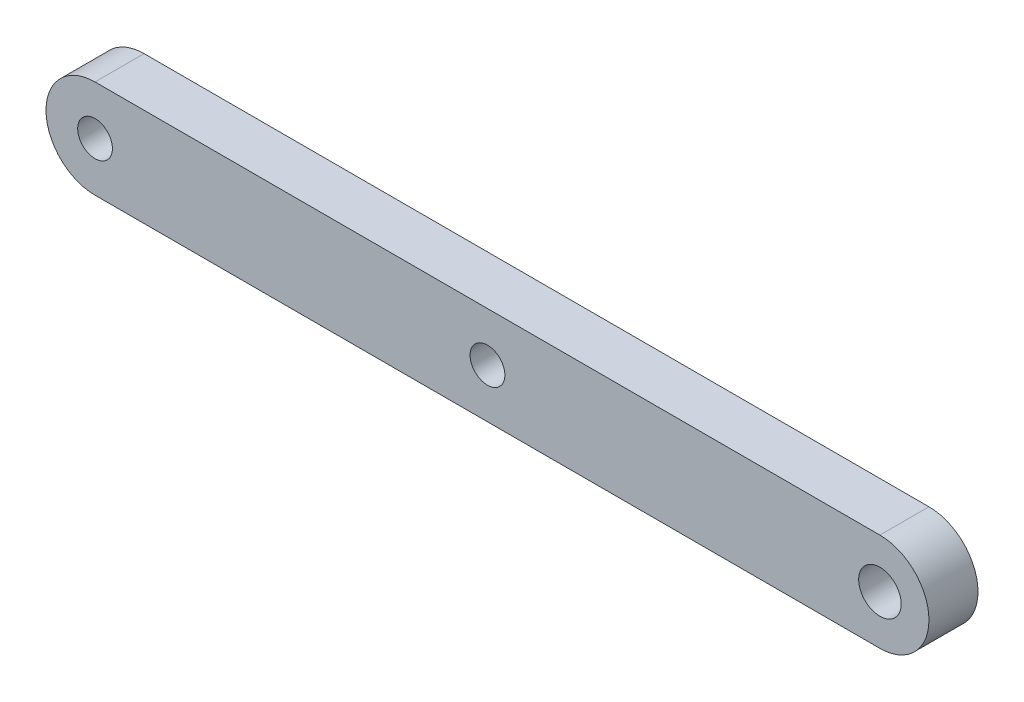
ISO-10303-21;
HEADER;
FILE_DESCRIPTION(('STEP AP214'),'2;1');
FILE_NAME('part.step','',(''),(''),'','','');
FILE_SCHEMA(('AUTOMOTIVE_DESIGN { 1 0 10303 214 1 1 1 1 }'));
ENDSEC;
DATA;
#1=APPLICATION_CONTEXT('core data for automotive mechanical design processes');
#2=APPLICATION_PROTOCOL_DEFINITION('international standard','automotive_design',2000,#1);
#3=PRODUCT_CONTEXT('',#1,'mechanical');
#4=PRODUCT('Part','Part','',(#3));
#5=PRODUCT_RELATED_PRODUCT_CATEGORY('part','',(#4));
#6=PRODUCT_DEFINITION_FORMATION('','',#4);
#7=PRODUCT_DEFINITION_CONTEXT('part definition',#1,'design');
#8=PRODUCT_DEFINITION('design','',#6,#7);
#9=PRODUCT_DEFINITION_SHAPE('','',#8);
#10=(LENGTH_UNIT() NAMED_UNIT(*) SI_UNIT(.MILLI.,.METRE.));
#11=(NAMED_UNIT(*) PLANE_ANGLE_UNIT() SI_UNIT($,.RADIAN.));
#12=(NAMED_UNIT(*) SI_UNIT($,.STERADIAN.) SOLID_ANGLE_UNIT());
#13=UNCERTAINTY_MEASURE_WITH_UNIT(LENGTH_MEASURE(1.E-05),#10,'distance_accuracy_value','');
#14=(GEOMETRIC_REPRESENTATION_CONTEXT(3) GLOBAL_UNCERTAINTY_ASSIGNED_CONTEXT((#13)) GLOBAL_UNIT_ASSIGNED_CONTEXT((#10,
#11,#12)) REPRESENTATION_CONTEXT('',''));
#15=CARTESIAN_POINT('',(0.,0.,0.));
#16=DIRECTION('',(0.,0.,1.));
#17=DIRECTION('',(1.,0.,0.));
#18=AXIS2_PLACEMENT_3D('',#15,#16,#17);
#19=CARTESIAN_POINT('',(0.,0.,6.35));
#20=DIRECTION('',(0.,0.,-1.));
#21=DIRECTION('',(-1.,0.,0.));
#22=AXIS2_PLACEMENT_3D('',#19,#20,#21);
#23=CYLINDRICAL_SURFACE('',#22,6.35);
#24=CARTESIAN_POINT('',(0.,0.,0.));
#25=DIRECTION('',(0.,0.,1.));
#26=DIRECTION('',(1.,0.,0.));
#27=AXIS2_PLACEMENT_3D('',#24,#25,#26);
#28=CIRCLE('',#27,6.35);
#29=CARTESIAN_POINT('',(0.,6.35,0.));
#30=VERTEX_POINT('',#29);
#31=CARTESIAN_POINT('',(0.,-6.35,0.));
#32=VERTEX_POINT('',#31);
#33=EDGE_CURVE('E95',#30,#32,#28,.T.);
#34=ORIENTED_EDGE('',*,*,#33,.T.);
#35=DIRECTION('',(0.,0.,-1.));
#36=VECTOR('',#35,1.);
#37=CARTESIAN_POINT('',(0.,-6.35,6.35));
#38=LINE('',#37,#36);
#39=CARTESIAN_POINT('',(0.,-6.35,6.35));
#40=VERTEX_POINT('',#39);
#41=EDGE_CURVE('E11',#40,#32,#38,.T.);
#42=ORIENTED_EDGE('',*,*,#41,.F.);
#43=CARTESIAN_POINT('',(0.,0.,6.35));
#44=DIRECTION('',(0.,0.,1.));
#45=DIRECTION('',(1.,0.,0.));
#46=AXIS2_PLACEMENT_3D('',#43,#44,#45);
#47=CIRCLE('',#46,6.35);
#48=CARTESIAN_POINT('',(0.,6.35,6.35));
#49=VERTEX_POINT('',#48);
#50=EDGE_CURVE('E83',#49,#40,#47,.T.);
#51=ORIENTED_EDGE('',*,*,#50,.F.);
#52=DIRECTION('',(0.,0.,-1.));
#53=VECTOR('',#52,1.);
#54=CARTESIAN_POINT('',(0.,6.35,6.35));
#55=LINE('',#54,#53);
#56=EDGE_CURVE('E91',#49,#30,#55,.T.);
#57=ORIENTED_EDGE('',*,*,#56,.T.);
#58=EDGE_LOOP('',(#34,#42,#51,#57));
#59=FACE_BOUND('',#58,.T.);
#60=ADVANCED_FACE('F32',(#59),#23,.T.);
#61=CARTESIAN_POINT('',(0.,-6.35,6.35));
#62=DIRECTION('',(0.,1.,0.));
#63=DIRECTION('',(0.,0.,1.));
#64=AXIS2_PLACEMENT_3D('',#61,#62,#63);
#65=PLANE('',#64);
#66=DIRECTION('',(1.,0.,0.));
#67=VECTOR('',#66,1.);
#68=CARTESIAN_POINT('',(0.,-6.35,0.));
#69=LINE('',#68,#67);
#70=CARTESIAN_POINT('',(101.6,-6.35,0.));
#71=VERTEX_POINT('',#70);
#72=EDGE_CURVE('E87',#32,#71,#69,.T.);
#73=ORIENTED_EDGE('',*,*,#72,.T.);
#74=DIRECTION('',(0.,0.,-1.));
#75=VECTOR('',#74,1.);
#76=CARTESIAN_POINT('',(101.6,-6.35,6.35));
#77=LINE('',#76,#75);
#78=CARTESIAN_POINT('',(101.6,-6.35,6.35));
#79=VERTEX_POINT('',#78);
#80=EDGE_CURVE('E40',#79,#71,#77,.T.);
#81=ORIENTED_EDGE('',*,*,#80,.F.);
#82=DIRECTION('',(1.,0.,0.));
#83=VECTOR('',#82,1.);
#84=CARTESIAN_POINT('',(0.,-6.35,6.35));
#85=LINE('',#84,#83);
#86=EDGE_CURVE('E78',#40,#79,#85,.T.);
#87=ORIENTED_EDGE('',*,*,#86,.F.);
#88=ORIENTED_EDGE('',*,*,#41,.T.);
#89=EDGE_LOOP('',(#73,#81,#87,#88));
#90=FACE_BOUND('',#89,.T.);
#91=ADVANCED_FACE('F86',(#90),#65,.F.);
#92=CARTESIAN_POINT('',(101.6,0.,6.35));
#93=DIRECTION('',(0.,0.,-1.));
#94=DIRECTION('',(-1.,0.,0.));
#95=AXIS2_PLACEMENT_3D('',#92,#93,#94);
#96=CYLINDRICAL_SURFACE('',#95,6.35);
#97=CARTESIAN_POINT('',(101.6,0.,0.));
#98=DIRECTION('',(0.,0.,1.));
#99=DIRECTION('',(1.,0.,0.));
#100=AXIS2_PLACEMENT_3D('',#97,#98,#99);
#101=CIRCLE('',#100,6.35);
#102=CARTESIAN_POINT('',(101.6,6.35,0.));
#103=VERTEX_POINT('',#102);
#104=EDGE_CURVE('E65',#71,#103,#101,.T.);
#105=ORIENTED_EDGE('',*,*,#104,.T.);
#106=DIRECTION('',(0.,0.,-1.));
#107=VECTOR('',#106,1.);
#108=CARTESIAN_POINT('',(101.6,6.35,6.35));
#109=LINE('',#108,#107);
#110=CARTESIAN_POINT('',(101.6,6.35,6.35));
#111=VERTEX_POINT('',#110);
#112=EDGE_CURVE('E88',#111,#103,#109,.T.);
#113=ORIENTED_EDGE('',*,*,#112,.F.);
#114=CARTESIAN_POINT('',(101.6,0.,6.35));
#115=DIRECTION('',(0.,0.,1.));
#116=DIRECTION('',(1.,0.,0.));
#117=AXIS2_PLACEMENT_3D('',#114,#115,#116);
#118=CIRCLE('',#117,6.35);
#119=EDGE_CURVE('E81',#79,#111,#118,.T.);
#120=ORIENTED_EDGE('',*,*,#119,.F.);
#121=ORIENTED_EDGE('',*,*,#80,.T.);
#122=EDGE_LOOP('',(#105,#113,#120,#121));
#123=FACE_BOUND('',#122,.T.);
#124=ADVANCED_FACE('F89',(#123),#96,.T.);
#125=CARTESIAN_POINT('',(0.,6.35,6.35));
#126=DIRECTION('',(0.,-1.,0.));
#127=DIRECTION('',(0.,0.,-1.));
#128=AXIS2_PLACEMENT_3D('',#125,#126,#127);
#129=PLANE('',#128);
#130=DIRECTION('',(-1.,0.,0.));
#131=VECTOR('',#130,1.);
#132=CARTESIAN_POINT('',(0.,6.35,0.));
#133=LINE('',#132,#131);
#134=EDGE_CURVE('E71',#103,#30,#133,.T.);
#135=ORIENTED_EDGE('',*,*,#134,.T.);
#136=ORIENTED_EDGE('',*,*,#56,.F.);
#137=DIRECTION('',(-1.,0.,0.));
#138=VECTOR('',#137,1.);
#139=CARTESIAN_POINT('',(0.,6.35,6.35));
#140=LINE('',#139,#138);
#141=EDGE_CURVE('E48',#111,#49,#140,.T.);
#142=ORIENTED_EDGE('',*,*,#141,.F.);
#143=ORIENTED_EDGE('',*,*,#112,.T.);
#144=EDGE_LOOP('',(#135,#136,#142,#143));
#145=FACE_BOUND('',#144,.T.);
#146=ADVANCED_FACE('F103',(#145),#129,.F.);
#147=CARTESIAN_POINT('',(0.,0.,6.35));
#148=DIRECTION('',(0.,0.,1.));
#149=DIRECTION('',(1.,0.,0.));
#150=AXIS2_PLACEMENT_3D('',#147,#148,#149);
#151=PLANE('',#150);
#152=CARTESIAN_POINT('',(50.8,0.,6.35));
#153=DIRECTION('',(0.,0.,-1.));
#154=DIRECTION('',(-1.,0.,0.));
#155=AXIS2_PLACEMENT_3D('',#152,#153,#154);
#156=CIRCLE('',#155,2.25);
#157=CARTESIAN_POINT('',(48.55,0.,6.35));
#158=VERTEX_POINT('',#157);
#159=EDGE_CURVE('E120',#158,#158,#156,.T.);
#160=ORIENTED_EDGE('',*,*,#159,.T.);
#161=EDGE_LOOP('',(#160));
#162=FACE_BOUND('',#161,.T.);
#163=CARTESIAN_POINT('',(0.,0.,6.35));
#164=DIRECTION('',(0.,0.,-1.));
#165=DIRECTION('',(-1.,0.,0.));
#166=AXIS2_PLACEMENT_3D('',#163,#164,#165);
#167=CIRCLE('',#166,2.25);
#168=CARTESIAN_POINT('',(-2.25,0.,6.35));
#169=VERTEX_POINT('',#168);
#170=EDGE_CURVE('E114',#169,#169,#167,.T.);
#171=ORIENTED_EDGE('',*,*,#170,.T.);
#172=EDGE_LOOP('',(#171));
#173=FACE_BOUND('',#172,.T.);
#174=CARTESIAN_POINT('',(101.6,0.,6.35));
#175=DIRECTION('',(0.,0.,-1.));
#176=DIRECTION('',(-1.,0.,0.));
#177=AXIS2_PLACEMENT_3D('',#174,#175,#176);
#178=CIRCLE('',#177,2.75);
#179=CARTESIAN_POINT('',(98.85,0.,6.35));
#180=VERTEX_POINT('',#179);
#181=EDGE_CURVE('E98',#180,#180,#178,.T.);
#182=ORIENTED_EDGE('',*,*,#181,.T.);
#183=EDGE_LOOP('',(#182));
#184=FACE_BOUND('',#183,.T.);
#185=ORIENTED_EDGE('',*,*,#50,.T.);
#186=ORIENTED_EDGE('',*,*,#86,.T.);
#187=ORIENTED_EDGE('',*,*,#119,.T.);
#188=ORIENTED_EDGE('',*,*,#141,.T.);
#189=EDGE_LOOP('',(#185,#186,#187,#188));
#190=FACE_BOUND('',#189,.T.);
#191=ADVANCED_FACE('F79',(#162,#173,#184,#190),#151,.T.);
#192=CARTESIAN_POINT('',(0.,0.,0.));
#193=DIRECTION('',(0.,0.,1.));
#194=DIRECTION('',(1.,0.,0.));
#195=AXIS2_PLACEMENT_3D('',#192,#193,#194);
#196=PLANE('',#195);
#197=CARTESIAN_POINT('',(50.8,0.,0.));
#198=DIRECTION('',(0.,0.,-1.));
#199=DIRECTION('',(-1.,0.,0.));
#200=AXIS2_PLACEMENT_3D('',#197,#198,#199);
#201=CIRCLE('',#200,2.25);
#202=CARTESIAN_POINT('',(48.55,0.,0.));
#203=VERTEX_POINT('',#202);
#204=EDGE_CURVE('E123',#203,#203,#201,.T.);
#205=ORIENTED_EDGE('',*,*,#204,.F.);
#206=EDGE_LOOP('',(#205));
#207=FACE_BOUND('',#206,.T.);
#208=CARTESIAN_POINT('',(0.,0.,0.));
#209=DIRECTION('',(0.,0.,-1.));
#210=DIRECTION('',(-1.,0.,0.));
#211=AXIS2_PLACEMENT_3D('',#208,#209,#210);
#212=CIRCLE('',#211,2.25);
#213=CARTESIAN_POINT('',(-2.25,0.,0.));
#214=VERTEX_POINT('',#213);
#215=EDGE_CURVE('E117',#214,#214,#212,.T.);
#216=ORIENTED_EDGE('',*,*,#215,.F.);
#217=EDGE_LOOP('',(#216));
#218=FACE_BOUND('',#217,.T.);
#219=CARTESIAN_POINT('',(101.6,0.,0.));
#220=DIRECTION('',(0.,0.,-1.));
#221=DIRECTION('',(-1.,0.,0.));
#222=AXIS2_PLACEMENT_3D('',#219,#220,#221);
#223=CIRCLE('',#222,2.75);
#224=CARTESIAN_POINT('',(98.85,0.,0.));
#225=VERTEX_POINT('',#224);
#226=EDGE_CURVE('E111',#225,#225,#223,.T.);
#227=ORIENTED_EDGE('',*,*,#226,.F.);
#228=EDGE_LOOP('',(#227));
#229=FACE_BOUND('',#228,.T.);
#230=ORIENTED_EDGE('',*,*,#33,.F.);
#231=ORIENTED_EDGE('',*,*,#134,.F.);
#232=ORIENTED_EDGE('',*,*,#104,.F.);
#233=ORIENTED_EDGE('',*,*,#72,.F.);
#234=EDGE_LOOP('',(#230,#231,#232,#233));
#235=FACE_BOUND('',#234,.T.);
#236=ADVANCED_FACE('F106',(#207,#218,#229,#235),#196,.F.);
#237=CARTESIAN_POINT('',(101.6,0.,0.));
#238=DIRECTION('',(0.,0.,-1.));
#239=DIRECTION('',(-1.,0.,0.));
#240=AXIS2_PLACEMENT_3D('',#237,#238,#239);
#241=CYLINDRICAL_SURFACE('',#240,2.75);
#242=ORIENTED_EDGE('',*,*,#181,.F.);
#243=EDGE_LOOP('',(#242));
#244=FACE_BOUND('',#243,.T.);
#245=ORIENTED_EDGE('',*,*,#226,.T.);
#246=EDGE_LOOP('',(#245));
#247=FACE_BOUND('',#246,.T.);
#248=ADVANCED_FACE('F131',(#244,#247),#241,.F.);
#249=CARTESIAN_POINT('',(0.,0.,0.));
#250=DIRECTION('',(0.,0.,-1.));
#251=DIRECTION('',(-1.,0.,0.));
#252=AXIS2_PLACEMENT_3D('',#249,#250,#251);
#253=CYLINDRICAL_SURFACE('',#252,2.25);
#254=ORIENTED_EDGE('',*,*,#170,.F.);
#255=EDGE_LOOP('',(#254));
#256=FACE_BOUND('',#255,.T.);
#257=ORIENTED_EDGE('',*,*,#215,.T.);
#258=EDGE_LOOP('',(#257));
#259=FACE_BOUND('',#258,.T.);
#260=ADVANCED_FACE('F138',(#256,#259),#253,.F.);
#261=CARTESIAN_POINT('',(50.8,0.,0.));
#262=DIRECTION('',(0.,0.,-1.));
#263=DIRECTION('',(-1.,0.,0.));
#264=AXIS2_PLACEMENT_3D('',#261,#262,#263);
#265=CYLINDRICAL_SURFACE('',#264,2.25);
#266=ORIENTED_EDGE('',*,*,#159,.F.);
#267=EDGE_LOOP('',(#266));
#268=FACE_BOUND('',#267,.T.);
#269=ORIENTED_EDGE('',*,*,#204,.T.);
#270=EDGE_LOOP('',(#269));
#271=FACE_BOUND('',#270,.T.);
#272=ADVANCED_FACE('F127',(#268,#271),#265,.F.);
#273=CLOSED_SHELL('',(#60,#91,#124,#146,#191,#236,#248,#260,#272));
#274=MANIFOLD_SOLID_BREP('B2',#273);
#275=ADVANCED_BREP_SHAPE_REPRESENTATION('',(#18,#274),#14);
#276=SHAPE_DEFINITION_REPRESENTATION(#9,#275);
ENDSEC;
END-ISO-10303-21;
